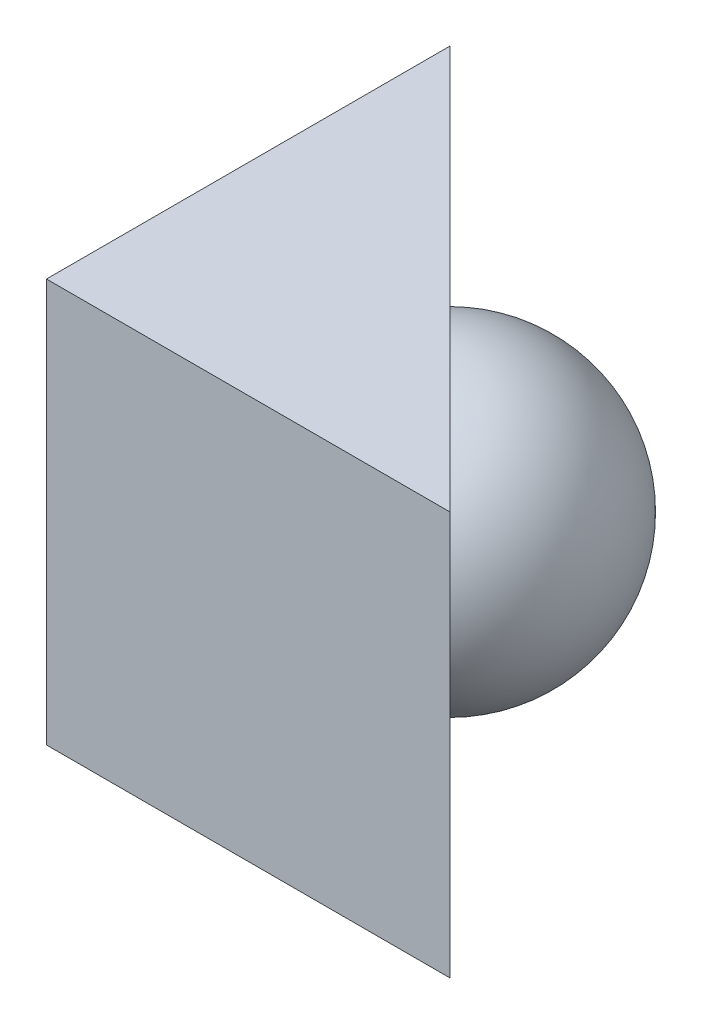
ISO-10303-21;
HEADER;
FILE_DESCRIPTION(('STEP AP214'),'2;1');
FILE_NAME('part.step','',(''),(''),'','','');
FILE_SCHEMA(('AUTOMOTIVE_DESIGN { 1 0 10303 214 1 1 1 1 }'));
ENDSEC;
DATA;
#1=APPLICATION_CONTEXT('core data for automotive mechanical design processes');
#2=APPLICATION_PROTOCOL_DEFINITION('international standard','automotive_design',2000,#1);
#3=PRODUCT_CONTEXT('',#1,'mechanical');
#4=PRODUCT('Part','Part','',(#3));
#5=PRODUCT_RELATED_PRODUCT_CATEGORY('part','',(#4));
#6=PRODUCT_DEFINITION_FORMATION('','',#4);
#7=PRODUCT_DEFINITION_CONTEXT('part definition',#1,'design');
#8=PRODUCT_DEFINITION('design','',#6,#7);
#9=PRODUCT_DEFINITION_SHAPE('','',#8);
#10=(LENGTH_UNIT() NAMED_UNIT(*) SI_UNIT(.MILLI.,.METRE.));
#11=(NAMED_UNIT(*) PLANE_ANGLE_UNIT() SI_UNIT($,.RADIAN.));
#12=(NAMED_UNIT(*) SI_UNIT($,.STERADIAN.) SOLID_ANGLE_UNIT());
#13=UNCERTAINTY_MEASURE_WITH_UNIT(LENGTH_MEASURE(1.E-05),#10,'distance_accuracy_value','');
#14=(GEOMETRIC_REPRESENTATION_CONTEXT(3) GLOBAL_UNCERTAINTY_ASSIGNED_CONTEXT((#13)) GLOBAL_UNIT_ASSIGNED_CONTEXT((#10,
#11,#12)) REPRESENTATION_CONTEXT('',''));
#15=CARTESIAN_POINT('',(0.,0.,0.));
#16=DIRECTION('',(0.,0.,1.));
#17=DIRECTION('',(1.,0.,0.));
#18=AXIS2_PLACEMENT_3D('',#15,#16,#17);
#19=CARTESIAN_POINT('',(0.,0.,0.));
#20=DIRECTION('',(-1.,0.,0.));
#21=DIRECTION('',(0.,0.,-1.));
#22=AXIS2_PLACEMENT_3D('',#19,#20,#21);
#23=SPHERICAL_SURFACE('',#22,18.);
#24=CARTESIAN_POINT('',(0.,0.,0.));
#25=DIRECTION('',(-0.707106781186547,0.,0.707106781186548));
#26=DIRECTION('',(0.707106781186548,0.,0.707106781186547));
#27=AXIS2_PLACEMENT_3D('',#24,#25,#26);
#28=SPHERICAL_SURFACE('',#27,18.);
#29=CARTESIAN_POINT('',(0.,0.,0.));
#30=DIRECTION('',(-0.707106781186547,0.,0.707106781186547));
#31=DIRECTION('',(0.707106781186548,0.,0.707106781186547));
#32=AXIS2_PLACEMENT_3D('',#29,#30,#31);
#33=CIRCLE('',#32,18.);
#34=CARTESIAN_POINT('',(12.7279220613579,0.,12.7279220613579));
#35=VERTEX_POINT('',#34);
#36=EDGE_CURVE('E11',#35,#35,#33,.T.);
#37=ORIENTED_EDGE('',*,*,#36,.F.);
#38=EDGE_LOOP('',(#37));
#39=FACE_BOUND('',#38,.T.);
#40=ADVANCED_FACE('F35',(#39),#28,.T.);
#41=CARTESIAN_POINT('',(-25.,25.,-25.));
#42=DIRECTION('',(1.,0.,0.));
#43=DIRECTION('',(0.,0.,-1.));
#44=AXIS2_PLACEMENT_3D('',#41,#42,#43);
#45=PLANE('',#44);
#46=DIRECTION('',(0.,0.,1.));
#47=VECTOR('',#46,1.);
#48=CARTESIAN_POINT('',(-25.,-25.,-25.));
#49=LINE('',#48,#47);
#50=CARTESIAN_POINT('',(-25.,-25.,-25.));
#51=VERTEX_POINT('',#50);
#52=CARTESIAN_POINT('',(-25.,-25.,25.));
#53=VERTEX_POINT('',#52);
#54=EDGE_CURVE('E85',#51,#53,#49,.T.);
#55=ORIENTED_EDGE('',*,*,#54,.T.);
#56=DIRECTION('',(0.,-1.,0.));
#57=VECTOR('',#56,1.);
#58=CARTESIAN_POINT('',(-25.,25.,25.));
#59=LINE('',#58,#57);
#60=CARTESIAN_POINT('',(-25.,25.,25.));
#61=VERTEX_POINT('',#60);
#62=EDGE_CURVE('E43',#61,#53,#59,.T.);
#63=ORIENTED_EDGE('',*,*,#62,.F.);
#64=DIRECTION('',(0.,0.,1.));
#65=VECTOR('',#64,1.);
#66=CARTESIAN_POINT('',(-25.,25.,-25.));
#67=LINE('',#66,#65);
#68=CARTESIAN_POINT('',(-25.,25.,-25.));
#69=VERTEX_POINT('',#68);
#70=EDGE_CURVE('E77',#69,#61,#67,.T.);
#71=ORIENTED_EDGE('',*,*,#70,.F.);
#72=DIRECTION('',(0.,-1.,0.));
#73=VECTOR('',#72,1.);
#74=CARTESIAN_POINT('',(-25.,25.,-25.));
#75=LINE('',#74,#73);
#76=EDGE_CURVE('E86',#69,#51,#75,.T.);
#77=ORIENTED_EDGE('',*,*,#76,.T.);
#78=EDGE_LOOP('',(#55,#63,#71,#77));
#79=FACE_BOUND('',#78,.T.);
#80=ADVANCED_FACE('F83',(#79),#45,.F.);
#81=CARTESIAN_POINT('',(25.,25.,25.));
#82=DIRECTION('',(0.,0.,-1.));
#83=DIRECTION('',(-1.,0.,0.));
#84=AXIS2_PLACEMENT_3D('',#81,#82,#83);
#85=PLANE('',#84);
#86=DIRECTION('',(1.,0.,0.));
#87=VECTOR('',#86,1.);
#88=CARTESIAN_POINT('',(25.,-25.,25.));
#89=LINE('',#88,#87);
#90=CARTESIAN_POINT('',(25.,-25.,25.));
#91=VERTEX_POINT('',#90);
#92=EDGE_CURVE('E64',#53,#91,#89,.T.);
#93=ORIENTED_EDGE('',*,*,#92,.T.);
#94=DIRECTION('',(0.,-1.,0.));
#95=VECTOR('',#94,1.);
#96=CARTESIAN_POINT('',(25.,25.,25.));
#97=LINE('',#96,#95);
#98=CARTESIAN_POINT('',(25.,25.,25.));
#99=VERTEX_POINT('',#98);
#100=EDGE_CURVE('E76',#99,#91,#97,.T.);
#101=ORIENTED_EDGE('',*,*,#100,.F.);
#102=DIRECTION('',(1.,0.,0.));
#103=VECTOR('',#102,1.);
#104=CARTESIAN_POINT('',(25.,25.,25.));
#105=LINE('',#104,#103);
#106=EDGE_CURVE('E72',#61,#99,#105,.T.);
#107=ORIENTED_EDGE('',*,*,#106,.F.);
#108=ORIENTED_EDGE('',*,*,#62,.T.);
#109=EDGE_LOOP('',(#93,#101,#107,#108));
#110=FACE_BOUND('',#109,.T.);
#111=ADVANCED_FACE('F73',(#110),#85,.F.);
#112=CARTESIAN_POINT('',(25.,25.,25.));
#113=DIRECTION('',(-0.707106781186547,0.,0.707106781186547));
#114=DIRECTION('',(0.707106781186548,0.,0.707106781186547));
#115=AXIS2_PLACEMENT_3D('',#112,#113,#114);
#116=PLANE('',#115);
#117=ORIENTED_EDGE('',*,*,#36,.T.);
#118=EDGE_LOOP('',(#117));
#119=FACE_BOUND('',#118,.T.);
#120=DIRECTION('',(-0.707106781186547,0.,-0.707106781186547));
#121=VECTOR('',#120,1.);
#122=CARTESIAN_POINT('',(25.,-25.,25.));
#123=LINE('',#122,#121);
#124=EDGE_CURVE('E69',#91,#51,#123,.T.);
#125=ORIENTED_EDGE('',*,*,#124,.T.);
#126=ORIENTED_EDGE('',*,*,#76,.F.);
#127=DIRECTION('',(-0.707106781186547,0.,-0.707106781186547));
#128=VECTOR('',#127,1.);
#129=CARTESIAN_POINT('',(25.,25.,25.));
#130=LINE('',#129,#128);
#131=EDGE_CURVE('E51',#99,#69,#130,.T.);
#132=ORIENTED_EDGE('',*,*,#131,.F.);
#133=ORIENTED_EDGE('',*,*,#100,.T.);
#134=EDGE_LOOP('',(#125,#126,#132,#133));
#135=FACE_BOUND('',#134,.T.);
#136=ADVANCED_FACE('F100',(#119,#135),#116,.F.);
#137=CARTESIAN_POINT('',(0.,25.,0.));
#138=DIRECTION('',(0.,-1.,0.));
#139=DIRECTION('',(0.,0.,-1.));
#140=AXIS2_PLACEMENT_3D('',#137,#138,#139);
#141=PLANE('',#140);
#142=ORIENTED_EDGE('',*,*,#70,.T.);
#143=ORIENTED_EDGE('',*,*,#106,.T.);
#144=ORIENTED_EDGE('',*,*,#131,.T.);
#145=EDGE_LOOP('',(#142,#143,#144));
#146=FACE_BOUND('',#145,.T.);
#147=ADVANCED_FACE('F80',(#146),#141,.F.);
#148=CARTESIAN_POINT('',(0.,-25.,0.));
#149=DIRECTION('',(0.,-1.,0.));
#150=DIRECTION('',(0.,0.,-1.));
#151=AXIS2_PLACEMENT_3D('',#148,#149,#150);
#152=PLANE('',#151);
#153=ORIENTED_EDGE('',*,*,#54,.F.);
#154=ORIENTED_EDGE('',*,*,#124,.F.);
#155=ORIENTED_EDGE('',*,*,#92,.F.);
#156=EDGE_LOOP('',(#153,#154,#155));
#157=FACE_BOUND('',#156,.T.);
#158=ADVANCED_FACE('F94',(#157),#152,.T.);
#159=CLOSED_SHELL('',(#40,#80,#111,#136,#147,#158));
#160=MANIFOLD_SOLID_BREP('B2',#159);
#161=ADVANCED_BREP_SHAPE_REPRESENTATION('',(#18,#160),#14);
#162=SHAPE_DEFINITION_REPRESENTATION(#9,#161);
ENDSEC;
END-ISO-10303-21;
